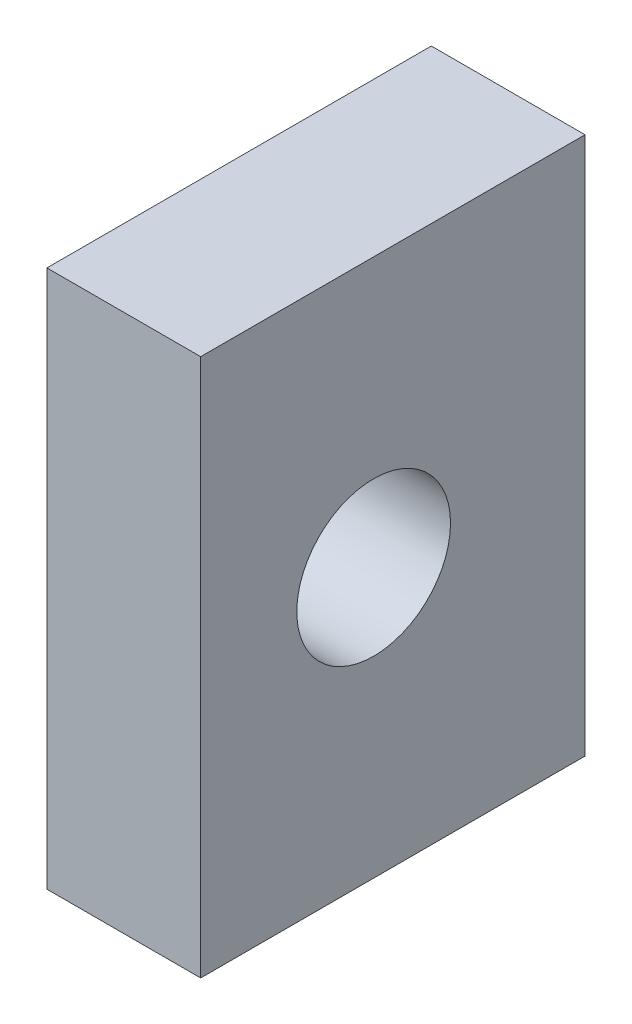
ISO-10303-21;
HEADER;
FILE_DESCRIPTION(('STEP AP214'),'2;1');
FILE_NAME('part.step','',(''),(''),'','','');
FILE_SCHEMA(('AUTOMOTIVE_DESIGN { 1 0 10303 214 1 1 1 1 }'));
ENDSEC;
DATA;
#1=APPLICATION_CONTEXT('core data for automotive mechanical design processes');
#2=APPLICATION_PROTOCOL_DEFINITION('international standard','automotive_design',2000,#1);
#3=PRODUCT_CONTEXT('',#1,'mechanical');
#4=PRODUCT('Part','Part','',(#3));
#5=PRODUCT_RELATED_PRODUCT_CATEGORY('part','',(#4));
#6=PRODUCT_DEFINITION_FORMATION('','',#4);
#7=PRODUCT_DEFINITION_CONTEXT('part definition',#1,'design');
#8=PRODUCT_DEFINITION('design','',#6,#7);
#9=PRODUCT_DEFINITION_SHAPE('','',#8);
#10=(LENGTH_UNIT() NAMED_UNIT(*) SI_UNIT(.MILLI.,.METRE.));
#11=(NAMED_UNIT(*) PLANE_ANGLE_UNIT() SI_UNIT($,.RADIAN.));
#12=(NAMED_UNIT(*) SI_UNIT($,.STERADIAN.) SOLID_ANGLE_UNIT());
#13=UNCERTAINTY_MEASURE_WITH_UNIT(LENGTH_MEASURE(1.E-05),#10,'distance_accuracy_value','');
#14=(GEOMETRIC_REPRESENTATION_CONTEXT(3) GLOBAL_UNCERTAINTY_ASSIGNED_CONTEXT((#13)) GLOBAL_UNIT_ASSIGNED_CONTEXT((#10,
#11,#12)) REPRESENTATION_CONTEXT('',''));
#15=CARTESIAN_POINT('',(0.,0.,0.));
#16=DIRECTION('',(0.,0.,1.));
#17=DIRECTION('',(1.,0.,0.));
#18=AXIS2_PLACEMENT_3D('',#15,#16,#17);
#19=CARTESIAN_POINT('',(12.7,0.,0.));
#20=DIRECTION('',(-1.,0.,0.));
#21=DIRECTION('',(0.,0.,1.));
#22=AXIS2_PLACEMENT_3D('',#19,#20,#21);
#23=PLANE('',#22);
#24=DIRECTION('',(0.,1.,0.));
#25=VECTOR('',#24,1.);
#26=CARTESIAN_POINT('',(12.7,-22.225,-15.875));
#27=LINE('',#26,#25);
#28=CARTESIAN_POINT('',(12.7,-22.225,-15.875));
#29=VERTEX_POINT('',#28);
#30=CARTESIAN_POINT('',(12.7,22.225,-15.875));
#31=VERTEX_POINT('',#30);
#32=EDGE_CURVE('E85',#29,#31,#27,.T.);
#33=ORIENTED_EDGE('',*,*,#32,.T.);
#34=DIRECTION('',(0.,0.,1.));
#35=VECTOR('',#34,1.);
#36=CARTESIAN_POINT('',(12.7,22.225,15.875));
#37=LINE('',#36,#35);
#38=CARTESIAN_POINT('',(12.7,22.225,15.875));
#39=VERTEX_POINT('',#38);
#40=EDGE_CURVE('E80',#31,#39,#37,.T.);
#41=ORIENTED_EDGE('',*,*,#40,.T.);
#42=DIRECTION('',(0.,-1.,0.));
#43=VECTOR('',#42,1.);
#44=CARTESIAN_POINT('',(12.7,-22.225,15.875));
#45=LINE('',#44,#43);
#46=CARTESIAN_POINT('',(12.7,-22.225,15.875));
#47=VERTEX_POINT('',#46);
#48=EDGE_CURVE('E83',#39,#47,#45,.T.);
#49=ORIENTED_EDGE('',*,*,#48,.T.);
#50=DIRECTION('',(0.,0.,-1.));
#51=VECTOR('',#50,1.);
#52=CARTESIAN_POINT('',(12.7,-22.225,15.875));
#53=LINE('',#52,#51);
#54=EDGE_CURVE('E50',#47,#29,#53,.T.);
#55=ORIENTED_EDGE('',*,*,#54,.T.);
#56=EDGE_LOOP('',(#33,#41,#49,#55));
#57=FACE_BOUND('',#56,.T.);
#58=CARTESIAN_POINT('',(12.7,0.,1.5875));
#59=DIRECTION('',(1.,0.,0.));
#60=DIRECTION('',(0.,0.,-1.));
#61=AXIS2_PLACEMENT_3D('',#58,#59,#60);
#62=CIRCLE('',#61,6.35);
#63=CARTESIAN_POINT('',(12.7,0.,-4.7625));
#64=VERTEX_POINT('',#63);
#65=EDGE_CURVE('E100',#64,#64,#62,.T.);
#66=ORIENTED_EDGE('',*,*,#65,.F.);
#67=EDGE_LOOP('',(#66));
#68=FACE_BOUND('',#67,.T.);
#69=ADVANCED_FACE('F33',(#57,#68),#23,.F.);
#70=CARTESIAN_POINT('',(0.,0.,0.));
#71=DIRECTION('',(-1.,0.,0.));
#72=DIRECTION('',(0.,0.,1.));
#73=AXIS2_PLACEMENT_3D('',#70,#71,#72);
#74=PLANE('',#73);
#75=DIRECTION('',(0.,1.,0.));
#76=VECTOR('',#75,1.);
#77=CARTESIAN_POINT('',(0.,-22.225,-15.875));
#78=LINE('',#77,#76);
#79=CARTESIAN_POINT('',(0.,-22.225,-15.875));
#80=VERTEX_POINT('',#79);
#81=CARTESIAN_POINT('',(0.,22.225,-15.875));
#82=VERTEX_POINT('',#81);
#83=EDGE_CURVE('E97',#80,#82,#78,.T.);
#84=ORIENTED_EDGE('',*,*,#83,.F.);
#85=DIRECTION('',(0.,0.,-1.));
#86=VECTOR('',#85,1.);
#87=CARTESIAN_POINT('',(0.,-22.225,15.875));
#88=LINE('',#87,#86);
#89=CARTESIAN_POINT('',(0.,-22.225,15.875));
#90=VERTEX_POINT('',#89);
#91=EDGE_CURVE('E73',#90,#80,#88,.T.);
#92=ORIENTED_EDGE('',*,*,#91,.F.);
#93=DIRECTION('',(0.,-1.,0.));
#94=VECTOR('',#93,1.);
#95=CARTESIAN_POINT('',(0.,-22.225,15.875));
#96=LINE('',#95,#94);
#97=CARTESIAN_POINT('',(0.,22.225,15.875));
#98=VERTEX_POINT('',#97);
#99=EDGE_CURVE('E67',#98,#90,#96,.T.);
#100=ORIENTED_EDGE('',*,*,#99,.F.);
#101=DIRECTION('',(0.,0.,1.));
#102=VECTOR('',#101,1.);
#103=CARTESIAN_POINT('',(0.,22.225,15.875));
#104=LINE('',#103,#102);
#105=EDGE_CURVE('E89',#82,#98,#104,.T.);
#106=ORIENTED_EDGE('',*,*,#105,.F.);
#107=EDGE_LOOP('',(#84,#92,#100,#106));
#108=FACE_BOUND('',#107,.T.);
#109=CARTESIAN_POINT('',(0.,0.,1.5875));
#110=DIRECTION('',(1.,0.,0.));
#111=DIRECTION('',(0.,0.,-1.));
#112=AXIS2_PLACEMENT_3D('',#109,#110,#111);
#113=CIRCLE('',#112,6.35);
#114=CARTESIAN_POINT('',(0.,0.,-4.7625));
#115=VERTEX_POINT('',#114);
#116=EDGE_CURVE('E112',#115,#115,#113,.T.);
#117=ORIENTED_EDGE('',*,*,#116,.T.);
#118=EDGE_LOOP('',(#117));
#119=FACE_BOUND('',#118,.T.);
#120=ADVANCED_FACE('F108',(#108,#119),#74,.T.);
#121=CARTESIAN_POINT('',(12.7,-22.225,-15.875));
#122=DIRECTION('',(0.,0.,1.));
#123=DIRECTION('',(1.,0.,0.));
#124=AXIS2_PLACEMENT_3D('',#121,#122,#123);
#125=PLANE('',#124);
#126=ORIENTED_EDGE('',*,*,#83,.T.);
#127=DIRECTION('',(-1.,0.,0.));
#128=VECTOR('',#127,1.);
#129=CARTESIAN_POINT('',(12.7,22.225,-15.875));
#130=LINE('',#129,#128);
#131=EDGE_CURVE('E11',#31,#82,#130,.T.);
#132=ORIENTED_EDGE('',*,*,#131,.F.);
#133=ORIENTED_EDGE('',*,*,#32,.F.);
#134=DIRECTION('',(-1.,0.,0.));
#135=VECTOR('',#134,1.);
#136=CARTESIAN_POINT('',(12.7,-22.225,-15.875));
#137=LINE('',#136,#135);
#138=EDGE_CURVE('E93',#29,#80,#137,.T.);
#139=ORIENTED_EDGE('',*,*,#138,.T.);
#140=EDGE_LOOP('',(#126,#132,#133,#139));
#141=FACE_BOUND('',#140,.T.);
#142=ADVANCED_FACE('F35',(#141),#125,.F.);
#143=CARTESIAN_POINT('',(12.7,22.225,15.875));
#144=DIRECTION('',(0.,-1.,0.));
#145=DIRECTION('',(0.,0.,-1.));
#146=AXIS2_PLACEMENT_3D('',#143,#144,#145);
#147=PLANE('',#146);
#148=ORIENTED_EDGE('',*,*,#105,.T.);
#149=DIRECTION('',(-1.,0.,0.));
#150=VECTOR('',#149,1.);
#151=CARTESIAN_POINT('',(12.7,22.225,15.875));
#152=LINE('',#151,#150);
#153=EDGE_CURVE('E42',#39,#98,#152,.T.);
#154=ORIENTED_EDGE('',*,*,#153,.F.);
#155=ORIENTED_EDGE('',*,*,#40,.F.);
#156=ORIENTED_EDGE('',*,*,#131,.T.);
#157=EDGE_LOOP('',(#148,#154,#155,#156));
#158=FACE_BOUND('',#157,.T.);
#159=ADVANCED_FACE('F88',(#158),#147,.F.);
#160=CARTESIAN_POINT('',(12.7,-22.225,15.875));
#161=DIRECTION('',(0.,0.,-1.));
#162=DIRECTION('',(-1.,0.,0.));
#163=AXIS2_PLACEMENT_3D('',#160,#161,#162);
#164=PLANE('',#163);
#165=ORIENTED_EDGE('',*,*,#99,.T.);
#166=DIRECTION('',(-1.,0.,0.));
#167=VECTOR('',#166,1.);
#168=CARTESIAN_POINT('',(12.7,-22.225,15.875));
#169=LINE('',#168,#167);
#170=EDGE_CURVE('E90',#47,#90,#169,.T.);
#171=ORIENTED_EDGE('',*,*,#170,.F.);
#172=ORIENTED_EDGE('',*,*,#48,.F.);
#173=ORIENTED_EDGE('',*,*,#153,.T.);
#174=EDGE_LOOP('',(#165,#171,#172,#173));
#175=FACE_BOUND('',#174,.T.);
#176=ADVANCED_FACE('F91',(#175),#164,.F.);
#177=CARTESIAN_POINT('',(12.7,-22.225,15.875));
#178=DIRECTION('',(0.,1.,0.));
#179=DIRECTION('',(0.,0.,1.));
#180=AXIS2_PLACEMENT_3D('',#177,#178,#179);
#181=PLANE('',#180);
#182=ORIENTED_EDGE('',*,*,#91,.T.);
#183=ORIENTED_EDGE('',*,*,#138,.F.);
#184=ORIENTED_EDGE('',*,*,#54,.F.);
#185=ORIENTED_EDGE('',*,*,#170,.T.);
#186=EDGE_LOOP('',(#182,#183,#184,#185));
#187=FACE_BOUND('',#186,.T.);
#188=ADVANCED_FACE('F105',(#187),#181,.F.);
#189=CARTESIAN_POINT('',(12.7,0.,1.5875));
#190=DIRECTION('',(-1.,0.,0.));
#191=DIRECTION('',(0.,0.,1.));
#192=AXIS2_PLACEMENT_3D('',#189,#190,#191);
#193=CYLINDRICAL_SURFACE('',#192,6.35);
#194=ORIENTED_EDGE('',*,*,#65,.T.);
#195=EDGE_LOOP('',(#194));
#196=FACE_BOUND('',#195,.T.);
#197=ORIENTED_EDGE('',*,*,#116,.F.);
#198=EDGE_LOOP('',(#197));
#199=FACE_BOUND('',#198,.T.);
#200=ADVANCED_FACE('F118',(#196,#199),#193,.F.);
#201=CLOSED_SHELL('',(#69,#120,#142,#159,#176,#188,#200));
#202=MANIFOLD_SOLID_BREP('B2',#201);
#203=ADVANCED_BREP_SHAPE_REPRESENTATION('',(#18,#202),#14);
#204=SHAPE_DEFINITION_REPRESENTATION(#9,#203);
ENDSEC;
END-ISO-10303-21;
